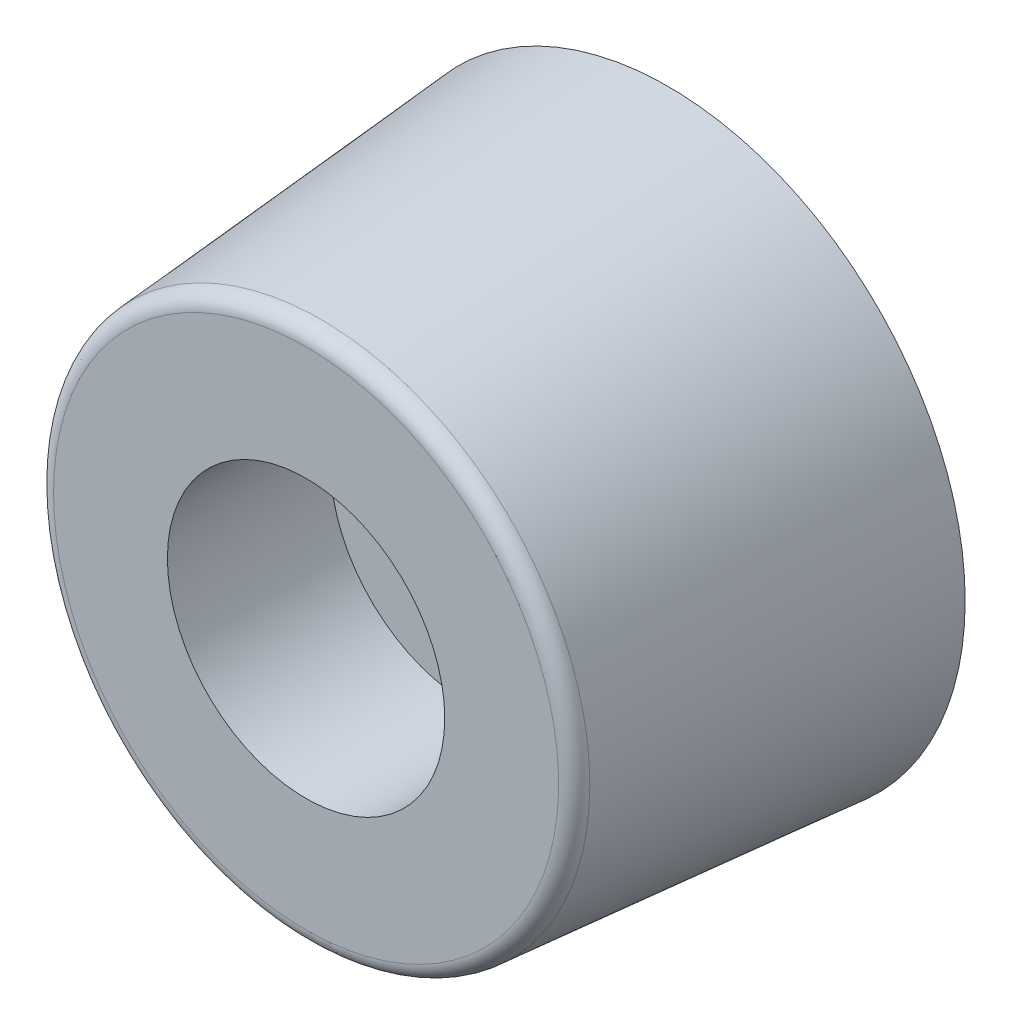
ISO-10303-21;
HEADER;
FILE_DESCRIPTION(('STEP AP214'),'2;1');
FILE_NAME('part.step','',(''),(''),'','','');
FILE_SCHEMA(('AUTOMOTIVE_DESIGN { 1 0 10303 214 1 1 1 1 }'));
ENDSEC;
DATA;
#1=APPLICATION_CONTEXT('core data for automotive mechanical design processes');
#2=APPLICATION_PROTOCOL_DEFINITION('international standard','automotive_design',2000,#1);
#3=PRODUCT_CONTEXT('',#1,'mechanical');
#4=PRODUCT('Part','Part','',(#3));
#5=PRODUCT_RELATED_PRODUCT_CATEGORY('part','',(#4));
#6=PRODUCT_DEFINITION_FORMATION('','',#4);
#7=PRODUCT_DEFINITION_CONTEXT('part definition',#1,'design');
#8=PRODUCT_DEFINITION('design','',#6,#7);
#9=PRODUCT_DEFINITION_SHAPE('','',#8);
#10=(LENGTH_UNIT() NAMED_UNIT(*) SI_UNIT(.MILLI.,.METRE.));
#11=(NAMED_UNIT(*) PLANE_ANGLE_UNIT() SI_UNIT($,.RADIAN.));
#12=(NAMED_UNIT(*) SI_UNIT($,.STERADIAN.) SOLID_ANGLE_UNIT());
#13=UNCERTAINTY_MEASURE_WITH_UNIT(LENGTH_MEASURE(1.E-05),#10,'distance_accuracy_value','');
#14=(GEOMETRIC_REPRESENTATION_CONTEXT(3) GLOBAL_UNCERTAINTY_ASSIGNED_CONTEXT((#13)) GLOBAL_UNIT_ASSIGNED_CONTEXT((#10,
#11,#12)) REPRESENTATION_CONTEXT('',''));
#15=CARTESIAN_POINT('',(0.,0.,0.));
#16=DIRECTION('',(0.,0.,1.));
#17=DIRECTION('',(1.,0.,0.));
#18=AXIS2_PLACEMENT_3D('',#15,#16,#17);
#19=CARTESIAN_POINT('',(0.,0.,0.));
#20=DIRECTION('',(0.,0.,-1.));
#21=DIRECTION('',(-1.,0.,0.));
#22=AXIS2_PLACEMENT_3D('',#19,#20,#21);
#23=CYLINDRICAL_SURFACE('',#22,2.45);
#24=CARTESIAN_POINT('',(0.,0.,-3.8));
#25=DIRECTION('',(0.,0.,-1.));
#26=DIRECTION('',(-1.,0.,0.));
#27=AXIS2_PLACEMENT_3D('',#24,#25,#26);
#28=CIRCLE('',#27,2.45);
#29=CARTESIAN_POINT('',(-2.45,0.,-3.8));
#30=VERTEX_POINT('',#29);
#31=EDGE_CURVE('E66',#30,#30,#28,.T.);
#32=ORIENTED_EDGE('',*,*,#31,.T.);
#33=EDGE_LOOP('',(#32));
#34=FACE_BOUND('',#33,.T.);
#35=CARTESIAN_POINT('',(0.,0.,0.));
#36=DIRECTION('',(0.,0.,-1.));
#37=DIRECTION('',(-1.,0.,0.));
#38=AXIS2_PLACEMENT_3D('',#35,#36,#37);
#39=CIRCLE('',#38,2.45);
#40=CARTESIAN_POINT('',(-2.45,0.,0.));
#41=VERTEX_POINT('',#40);
#42=EDGE_CURVE('E10',#41,#41,#39,.T.);
#43=ORIENTED_EDGE('',*,*,#42,.F.);
#44=EDGE_LOOP('',(#43));
#45=FACE_BOUND('',#44,.T.);
#46=ADVANCED_FACE('F35',(#34,#45),#23,.F.);
#47=CARTESIAN_POINT('',(0.,2.45,0.));
#48=DIRECTION('',(0.,0.,1.));
#49=DIRECTION('',(1.,0.,0.));
#50=AXIS2_PLACEMENT_3D('',#47,#48,#49);
#51=PLANE('',#50);
#52=ORIENTED_EDGE('',*,*,#42,.T.);
#53=EDGE_LOOP('',(#52));
#54=FACE_BOUND('',#53,.T.);
#55=CARTESIAN_POINT('',(0.,0.,0.));
#56=DIRECTION('',(0.,0.,-1.));
#57=DIRECTION('',(-1.,0.,0.));
#58=AXIS2_PLACEMENT_3D('',#55,#56,#57);
#59=CIRCLE('',#58,4.25);
#60=CARTESIAN_POINT('',(-4.25,0.,0.));
#61=VERTEX_POINT('',#60);
#62=EDGE_CURVE('E41',#61,#61,#59,.T.);
#63=ORIENTED_EDGE('',*,*,#62,.F.);
#64=EDGE_LOOP('',(#63));
#65=FACE_BOUND('',#64,.T.);
#66=ADVANCED_FACE('F84',(#54,#65),#51,.T.);
#67=CARTESIAN_POINT('',(0.,0.,0.));
#68=DIRECTION('',(0.,0.,-1.));
#69=DIRECTION('',(-1.,0.,0.));
#70=AXIS2_PLACEMENT_3D('',#67,#68,#69);
#71=CYLINDRICAL_SURFACE('',#70,4.25);
#72=ORIENTED_EDGE('',*,*,#62,.T.);
#73=EDGE_LOOP('',(#72));
#74=FACE_BOUND('',#73,.T.);
#75=CARTESIAN_POINT('',(0.,0.,5.));
#76=DIRECTION('',(0.,0.,-1.));
#77=DIRECTION('',(-1.,0.,0.));
#78=AXIS2_PLACEMENT_3D('',#75,#76,#77);
#79=CIRCLE('',#78,4.25);
#80=CARTESIAN_POINT('',(-4.25,0.,5.));
#81=VERTEX_POINT('',#80);
#82=EDGE_CURVE('E45',#81,#81,#79,.T.);
#83=ORIENTED_EDGE('',*,*,#82,.F.);
#84=EDGE_LOOP('',(#83));
#85=FACE_BOUND('',#84,.T.);
#86=ADVANCED_FACE('F88',(#74,#85),#71,.F.);
#87=CARTESIAN_POINT('',(0.,4.25,5.));
#88=DIRECTION('',(0.,0.,1.));
#89=DIRECTION('',(1.,0.,0.));
#90=AXIS2_PLACEMENT_3D('',#87,#88,#89);
#91=PLANE('',#90);
#92=ORIENTED_EDGE('',*,*,#82,.T.);
#93=EDGE_LOOP('',(#92));
#94=FACE_BOUND('',#93,.T.);
#95=CARTESIAN_POINT('',(0.,0.,5.));
#96=DIRECTION('',(0.,0.,-1.));
#97=DIRECTION('',(-1.,0.,0.));
#98=AXIS2_PLACEMENT_3D('',#95,#96,#97);
#99=CIRCLE('',#98,7.73889969747917);
#100=CARTESIAN_POINT('',(-7.73889969747917,0.,5.));
#101=VERTEX_POINT('',#100);
#102=EDGE_CURVE('E49',#101,#101,#99,.T.);
#103=ORIENTED_EDGE('',*,*,#102,.F.);
#104=EDGE_LOOP('',(#103));
#105=FACE_BOUND('',#104,.T.);
#106=ADVANCED_FACE('F92',(#94,#105),#91,.T.);
#107=CARTESIAN_POINT('',(0.,0.,4.5));
#108=DIRECTION('',(0.,0.,-1.));
#109=DIRECTION('',(-1.,0.,0.));
#110=AXIS2_PLACEMENT_3D('',#107,#108,#109);
#111=TOROIDAL_SURFACE('',#110,7.73889969747917,0.500000000000001);
#112=ORIENTED_EDGE('',*,*,#102,.T.);
#113=EDGE_LOOP('',(#112));
#114=FACE_BOUND('',#113,.T.);
#115=CARTESIAN_POINT('',(0.,0.,4.54040793438303));
#116=DIRECTION('',(0.,0.,-1.));
#117=DIRECTION('',(-1.,0.,0.));
#118=AXIS2_PLACEMENT_3D('',#115,#116,#117);
#119=CIRCLE('',#118,8.23726422153651);
#120=CARTESIAN_POINT('',(-8.23726422153651,0.,4.54040793438303));
#121=VERTEX_POINT('',#120);
#122=EDGE_CURVE('E54',#121,#121,#119,.T.);
#123=ORIENTED_EDGE('',*,*,#122,.F.);
#124=EDGE_LOOP('',(#123));
#125=FACE_BOUND('',#124,.T.);
#126=ADVANCED_FACE('F98',(#114,#125),#111,.T.);
#127=CARTESIAN_POINT('',(0.,0.,-6.1));
#128=DIRECTION('',(0.,0.,-1.));
#129=DIRECTION('',(-1.,0.,0.));
#130=AXIS2_PLACEMENT_3D('',#127,#128,#129);
#131=CONICAL_SURFACE('',#130,9.1,0.0809040991552307);
#132=ORIENTED_EDGE('',*,*,#122,.T.);
#133=EDGE_LOOP('',(#132));
#134=FACE_BOUND('',#133,.T.);
#135=CARTESIAN_POINT('',(0.,0.,-6.1));
#136=DIRECTION('',(0.,0.,-1.));
#137=DIRECTION('',(-1.,0.,0.));
#138=AXIS2_PLACEMENT_3D('',#135,#136,#137);
#139=CIRCLE('',#138,9.1);
#140=CARTESIAN_POINT('',(-9.1,0.,-6.1));
#141=VERTEX_POINT('',#140);
#142=EDGE_CURVE('E57',#141,#141,#139,.T.);
#143=ORIENTED_EDGE('',*,*,#142,.F.);
#144=EDGE_LOOP('',(#143));
#145=FACE_BOUND('',#144,.T.);
#146=ADVANCED_FACE('F102',(#134,#145),#131,.T.);
#147=CARTESIAN_POINT('',(0.,9.1,-6.1));
#148=DIRECTION('',(0.,0.,-1.));
#149=DIRECTION('',(-1.,0.,0.));
#150=AXIS2_PLACEMENT_3D('',#147,#148,#149);
#151=PLANE('',#150);
#152=ORIENTED_EDGE('',*,*,#142,.T.);
#153=EDGE_LOOP('',(#152));
#154=FACE_BOUND('',#153,.T.);
#155=CARTESIAN_POINT('',(0.,0.,-6.1));
#156=DIRECTION('',(0.,0.,-1.));
#157=DIRECTION('',(-1.,0.,0.));
#158=AXIS2_PLACEMENT_3D('',#155,#156,#157);
#159=CIRCLE('',#158,2.85);
#160=CARTESIAN_POINT('',(-2.85,0.,-6.1));
#161=VERTEX_POINT('',#160);
#162=EDGE_CURVE('E60',#161,#161,#159,.T.);
#163=ORIENTED_EDGE('',*,*,#162,.F.);
#164=EDGE_LOOP('',(#163));
#165=FACE_BOUND('',#164,.T.);
#166=ADVANCED_FACE('F80',(#154,#165),#151,.T.);
#167=CARTESIAN_POINT('',(0.,0.,0.));
#168=DIRECTION('',(0.,0.,-1.));
#169=DIRECTION('',(-1.,0.,0.));
#170=AXIS2_PLACEMENT_3D('',#167,#168,#169);
#171=CYLINDRICAL_SURFACE('',#170,2.85);
#172=ORIENTED_EDGE('',*,*,#162,.T.);
#173=EDGE_LOOP('',(#172));
#174=FACE_BOUND('',#173,.T.);
#175=CARTESIAN_POINT('',(0.,0.,-3.8));
#176=DIRECTION('',(0.,0.,-1.));
#177=DIRECTION('',(-1.,0.,0.));
#178=AXIS2_PLACEMENT_3D('',#175,#176,#177);
#179=CIRCLE('',#178,2.85);
#180=CARTESIAN_POINT('',(-2.85,0.,-3.8));
#181=VERTEX_POINT('',#180);
#182=EDGE_CURVE('E63',#181,#181,#179,.T.);
#183=ORIENTED_EDGE('',*,*,#182,.F.);
#184=EDGE_LOOP('',(#183));
#185=FACE_BOUND('',#184,.T.);
#186=ADVANCED_FACE('F74',(#174,#185),#171,.F.);
#187=CARTESIAN_POINT('',(0.,2.45,-3.8));
#188=DIRECTION('',(0.,0.,-1.));
#189=DIRECTION('',(-1.,0.,0.));
#190=AXIS2_PLACEMENT_3D('',#187,#188,#189);
#191=PLANE('',#190);
#192=ORIENTED_EDGE('',*,*,#182,.T.);
#193=EDGE_LOOP('',(#192));
#194=FACE_BOUND('',#193,.T.);
#195=ORIENTED_EDGE('',*,*,#31,.F.);
#196=EDGE_LOOP('',(#195));
#197=FACE_BOUND('',#196,.T.);
#198=ADVANCED_FACE('F72',(#194,#197),#191,.T.);
#199=CLOSED_SHELL('',(#46,#66,#86,#106,#126,#146,#166,#186,#198));
#200=MANIFOLD_SOLID_BREP('B2',#199);
#201=ADVANCED_BREP_SHAPE_REPRESENTATION('',(#18,#200),#14);
#202=SHAPE_DEFINITION_REPRESENTATION(#9,#201);
ENDSEC;
END-ISO-10303-21;
